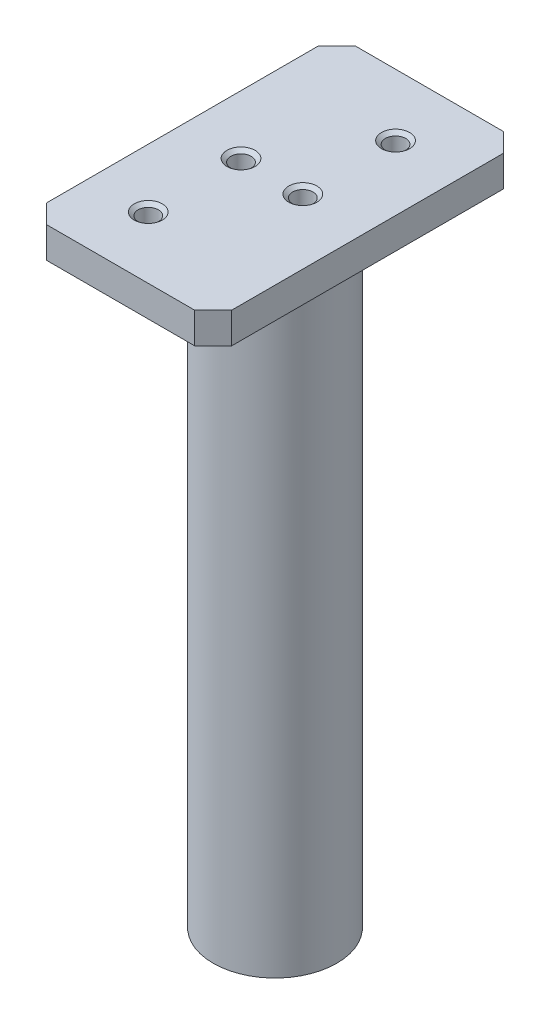
ISO-10303-21;
HEADER;
FILE_DESCRIPTION(('STEP AP214'),'2;1');
FILE_NAME('part.step','',(''),(''),'','','');
FILE_SCHEMA(('AUTOMOTIVE_DESIGN { 1 0 10303 214 1 1 1 1 }'));
ENDSEC;
DATA;
#1=APPLICATION_CONTEXT('core data for automotive mechanical design processes');
#2=APPLICATION_PROTOCOL_DEFINITION('international standard','automotive_design',2000,#1);
#3=PRODUCT_CONTEXT('',#1,'mechanical');
#4=PRODUCT('Part','Part','',(#3));
#5=PRODUCT_RELATED_PRODUCT_CATEGORY('part','',(#4));
#6=PRODUCT_DEFINITION_FORMATION('','',#4);
#7=PRODUCT_DEFINITION_CONTEXT('part definition',#1,'design');
#8=PRODUCT_DEFINITION('design','',#6,#7);
#9=PRODUCT_DEFINITION_SHAPE('','',#8);
#10=(LENGTH_UNIT() NAMED_UNIT(*) SI_UNIT(.MILLI.,.METRE.));
#11=(NAMED_UNIT(*) PLANE_ANGLE_UNIT() SI_UNIT($,.RADIAN.));
#12=(NAMED_UNIT(*) SI_UNIT($,.STERADIAN.) SOLID_ANGLE_UNIT());
#13=UNCERTAINTY_MEASURE_WITH_UNIT(LENGTH_MEASURE(1.E-05),#10,'distance_accuracy_value','');
#14=(GEOMETRIC_REPRESENTATION_CONTEXT(3) GLOBAL_UNCERTAINTY_ASSIGNED_CONTEXT((#13)) GLOBAL_UNIT_ASSIGNED_CONTEXT((#10,
#11,#12)) REPRESENTATION_CONTEXT('',''));
#15=CARTESIAN_POINT('',(0.,0.,0.));
#16=DIRECTION('',(0.,0.,1.));
#17=DIRECTION('',(1.,0.,0.));
#18=AXIS2_PLACEMENT_3D('',#15,#16,#17);
#19=CARTESIAN_POINT('',(15.,5.,-25.));
#20=DIRECTION('',(-1.,0.,0.));
#21=DIRECTION('',(0.,0.,1.));
#22=AXIS2_PLACEMENT_3D('',#19,#20,#21);
#23=PLANE('',#22);
#24=DIRECTION('',(0.,0.,-1.));
#25=VECTOR('',#24,1.);
#26=CARTESIAN_POINT('',(15.,0.,-25.));
#27=LINE('',#26,#25);
#28=CARTESIAN_POINT('',(15.,0.,22.));
#29=VERTEX_POINT('',#28);
#30=CARTESIAN_POINT('',(15.,0.,-22.));
#31=VERTEX_POINT('',#30);
#32=EDGE_CURVE('E197',#29,#31,#27,.T.);
#33=ORIENTED_EDGE('',*,*,#32,.T.);
#34=DIRECTION('',(0.,1.,0.));
#35=VECTOR('',#34,1.);
#36=CARTESIAN_POINT('',(15.,5.,-22.));
#37=LINE('',#36,#35);
#38=CARTESIAN_POINT('',(15.,5.,-22.));
#39=VERTEX_POINT('',#38);
#40=EDGE_CURVE('E11',#31,#39,#37,.T.);
#41=ORIENTED_EDGE('',*,*,#40,.T.);
#42=DIRECTION('',(0.,0.,-1.));
#43=VECTOR('',#42,1.);
#44=CARTESIAN_POINT('',(15.,5.,-25.));
#45=LINE('',#44,#43);
#46=CARTESIAN_POINT('',(15.,5.,22.));
#47=VERTEX_POINT('',#46);
#48=EDGE_CURVE('E146',#47,#39,#45,.T.);
#49=ORIENTED_EDGE('',*,*,#48,.F.);
#50=DIRECTION('',(0.,-1.,0.));
#51=VECTOR('',#50,1.);
#52=CARTESIAN_POINT('',(15.,5.,22.));
#53=LINE('',#52,#51);
#54=EDGE_CURVE('E59',#47,#29,#53,.T.);
#55=ORIENTED_EDGE('',*,*,#54,.T.);
#56=EDGE_LOOP('',(#33,#41,#49,#55));
#57=FACE_BOUND('',#56,.T.);
#58=ADVANCED_FACE('F49',(#57),#23,.F.);
#59=CARTESIAN_POINT('',(-15.,5.,-25.));
#60=DIRECTION('',(0.,0.,1.));
#61=DIRECTION('',(1.,0.,0.));
#62=AXIS2_PLACEMENT_3D('',#59,#60,#61);
#63=PLANE('',#62);
#64=DIRECTION('',(-1.,0.,0.));
#65=VECTOR('',#64,1.);
#66=CARTESIAN_POINT('',(-15.,0.,-25.));
#67=LINE('',#66,#65);
#68=CARTESIAN_POINT('',(12.,0.,-25.));
#69=VERTEX_POINT('',#68);
#70=CARTESIAN_POINT('',(-12.,0.,-25.));
#71=VERTEX_POINT('',#70);
#72=EDGE_CURVE('E153',#69,#71,#67,.T.);
#73=ORIENTED_EDGE('',*,*,#72,.T.);
#74=DIRECTION('',(0.,1.,0.));
#75=VECTOR('',#74,1.);
#76=CARTESIAN_POINT('',(-12.,5.,-25.));
#77=LINE('',#76,#75);
#78=CARTESIAN_POINT('',(-12.,5.,-25.));
#79=VERTEX_POINT('',#78);
#80=EDGE_CURVE('E66',#71,#79,#77,.T.);
#81=ORIENTED_EDGE('',*,*,#80,.T.);
#82=DIRECTION('',(-1.,0.,0.));
#83=VECTOR('',#82,1.);
#84=CARTESIAN_POINT('',(-15.,5.,-25.));
#85=LINE('',#84,#83);
#86=CARTESIAN_POINT('',(12.,5.,-25.));
#87=VERTEX_POINT('',#86);
#88=EDGE_CURVE('E151',#87,#79,#85,.T.);
#89=ORIENTED_EDGE('',*,*,#88,.F.);
#90=DIRECTION('',(0.,-1.,0.));
#91=VECTOR('',#90,1.);
#92=CARTESIAN_POINT('',(12.,5.,-25.));
#93=LINE('',#92,#91);
#94=EDGE_CURVE('E186',#87,#69,#93,.T.);
#95=ORIENTED_EDGE('',*,*,#94,.T.);
#96=EDGE_LOOP('',(#73,#81,#89,#95));
#97=FACE_BOUND('',#96,.T.);
#98=ADVANCED_FACE('F307',(#97),#63,.F.);
#99=CARTESIAN_POINT('',(-15.,5.,-25.));
#100=DIRECTION('',(1.,0.,0.));
#101=DIRECTION('',(0.,0.,-1.));
#102=AXIS2_PLACEMENT_3D('',#99,#100,#101);
#103=PLANE('',#102);
#104=DIRECTION('',(0.,0.,1.));
#105=VECTOR('',#104,1.);
#106=CARTESIAN_POINT('',(-15.,0.,-25.));
#107=LINE('',#106,#105);
#108=CARTESIAN_POINT('',(-15.,0.,-22.));
#109=VERTEX_POINT('',#108);
#110=CARTESIAN_POINT('',(-15.,0.,22.));
#111=VERTEX_POINT('',#110);
#112=EDGE_CURVE('E147',#109,#111,#107,.T.);
#113=ORIENTED_EDGE('',*,*,#112,.T.);
#114=DIRECTION('',(0.,1.,0.));
#115=VECTOR('',#114,1.);
#116=CARTESIAN_POINT('',(-15.,5.,22.));
#117=LINE('',#116,#115);
#118=CARTESIAN_POINT('',(-15.,5.,22.));
#119=VERTEX_POINT('',#118);
#120=EDGE_CURVE('E122',#111,#119,#117,.T.);
#121=ORIENTED_EDGE('',*,*,#120,.T.);
#122=DIRECTION('',(0.,0.,1.));
#123=VECTOR('',#122,1.);
#124=CARTESIAN_POINT('',(-15.,5.,-25.));
#125=LINE('',#124,#123);
#126=CARTESIAN_POINT('',(-15.,5.,-22.));
#127=VERTEX_POINT('',#126);
#128=EDGE_CURVE('E213',#127,#119,#125,.T.);
#129=ORIENTED_EDGE('',*,*,#128,.F.);
#130=DIRECTION('',(0.,-1.,0.));
#131=VECTOR('',#130,1.);
#132=CARTESIAN_POINT('',(-15.,5.,-22.));
#133=LINE('',#132,#131);
#134=EDGE_CURVE('E128',#127,#109,#133,.T.);
#135=ORIENTED_EDGE('',*,*,#134,.T.);
#136=EDGE_LOOP('',(#113,#121,#129,#135));
#137=FACE_BOUND('',#136,.T.);
#138=ADVANCED_FACE('F304',(#137),#103,.F.);
#139=CARTESIAN_POINT('',(-15.,5.,25.));
#140=DIRECTION('',(0.,0.,-1.));
#141=DIRECTION('',(-1.,0.,0.));
#142=AXIS2_PLACEMENT_3D('',#139,#140,#141);
#143=PLANE('',#142);
#144=DIRECTION('',(1.,0.,0.));
#145=VECTOR('',#144,1.);
#146=CARTESIAN_POINT('',(-15.,5.,25.));
#147=LINE('',#146,#145);
#148=CARTESIAN_POINT('',(-12.,5.,25.));
#149=VERTEX_POINT('',#148);
#150=CARTESIAN_POINT('',(12.,5.,25.));
#151=VERTEX_POINT('',#150);
#152=EDGE_CURVE('E138',#149,#151,#147,.T.);
#153=ORIENTED_EDGE('',*,*,#152,.F.);
#154=DIRECTION('',(0.,-1.,0.));
#155=VECTOR('',#154,1.);
#156=CARTESIAN_POINT('',(-12.,5.,25.));
#157=LINE('',#156,#155);
#158=CARTESIAN_POINT('',(-12.,0.,25.));
#159=VERTEX_POINT('',#158);
#160=EDGE_CURVE('E121',#149,#159,#157,.T.);
#161=ORIENTED_EDGE('',*,*,#160,.T.);
#162=DIRECTION('',(1.,0.,0.));
#163=VECTOR('',#162,1.);
#164=CARTESIAN_POINT('',(-15.,0.,25.));
#165=LINE('',#164,#163);
#166=CARTESIAN_POINT('',(12.,0.,25.));
#167=VERTEX_POINT('',#166);
#168=EDGE_CURVE('E135',#159,#167,#165,.T.);
#169=ORIENTED_EDGE('',*,*,#168,.T.);
#170=DIRECTION('',(0.,1.,0.));
#171=VECTOR('',#170,1.);
#172=CARTESIAN_POINT('',(12.,5.,25.));
#173=LINE('',#172,#171);
#174=EDGE_CURVE('E141',#167,#151,#173,.T.);
#175=ORIENTED_EDGE('',*,*,#174,.T.);
#176=EDGE_LOOP('',(#153,#161,#169,#175));
#177=FACE_BOUND('',#176,.T.);
#178=ADVANCED_FACE('F134',(#177),#143,.F.);
#179=CARTESIAN_POINT('',(0.,5.,0.));
#180=DIRECTION('',(0.,1.,0.));
#181=DIRECTION('',(0.,0.,1.));
#182=AXIS2_PLACEMENT_3D('',#179,#180,#181);
#183=PLANE('',#182);
#184=CARTESIAN_POINT('',(-5.49999999999999,5.,15.));
#185=DIRECTION('',(0.,1.,0.));
#186=DIRECTION('',(0.,0.,1.));
#187=AXIS2_PLACEMENT_3D('',#184,#185,#186);
#188=CIRCLE('',#187,2.275);
#189=CARTESIAN_POINT('',(-5.49999999999999,5.,17.275));
#190=VERTEX_POINT('',#189);
#191=EDGE_CURVE('E258',#190,#190,#188,.T.);
#192=ORIENTED_EDGE('',*,*,#191,.F.);
#193=EDGE_LOOP('',(#192));
#194=FACE_BOUND('',#193,.T.);
#195=CARTESIAN_POINT('',(-5.49999999999999,5.,0.));
#196=DIRECTION('',(0.,1.,0.));
#197=DIRECTION('',(0.,0.,1.));
#198=AXIS2_PLACEMENT_3D('',#195,#196,#197);
#199=CIRCLE('',#198,2.275);
#200=CARTESIAN_POINT('',(-5.49999999999999,5.,2.27500000000001));
#201=VERTEX_POINT('',#200);
#202=EDGE_CURVE('E246',#201,#201,#199,.T.);
#203=ORIENTED_EDGE('',*,*,#202,.F.);
#204=EDGE_LOOP('',(#203));
#205=FACE_BOUND('',#204,.T.);
#206=CARTESIAN_POINT('',(4.5,5.,0.));
#207=DIRECTION('',(0.,1.,0.));
#208=DIRECTION('',(0.,0.,1.));
#209=AXIS2_PLACEMENT_3D('',#206,#207,#208);
#210=CIRCLE('',#209,2.275);
#211=CARTESIAN_POINT('',(4.5,5.,2.275));
#212=VERTEX_POINT('',#211);
#213=EDGE_CURVE('E234',#212,#212,#210,.T.);
#214=ORIENTED_EDGE('',*,*,#213,.F.);
#215=EDGE_LOOP('',(#214));
#216=FACE_BOUND('',#215,.T.);
#217=CARTESIAN_POINT('',(4.5,5.,-15.));
#218=DIRECTION('',(0.,1.,0.));
#219=DIRECTION('',(0.,0.,1.));
#220=AXIS2_PLACEMENT_3D('',#217,#218,#219);
#221=CIRCLE('',#220,2.275);
#222=CARTESIAN_POINT('',(4.5,5.,-12.725));
#223=VERTEX_POINT('',#222);
#224=EDGE_CURVE('E222',#223,#223,#221,.T.);
#225=ORIENTED_EDGE('',*,*,#224,.F.);
#226=EDGE_LOOP('',(#225));
#227=FACE_BOUND('',#226,.T.);
#228=ORIENTED_EDGE('',*,*,#128,.T.);
#229=DIRECTION('',(-0.707106781186546,0.,-0.707106781186549));
#230=VECTOR('',#229,1.);
#231=CARTESIAN_POINT('',(-18.5,5.,18.4999999999999));
#232=LINE('',#231,#230);
#233=EDGE_CURVE('E183',#119,#149,#232,.F.);
#234=ORIENTED_EDGE('',*,*,#233,.T.);
#235=ORIENTED_EDGE('',*,*,#152,.T.);
#236=DIRECTION('',(-0.707106781186549,0.,0.707106781186546));
#237=VECTOR('',#236,1.);
#238=CARTESIAN_POINT('',(18.5,5.,18.5000000000001));
#239=LINE('',#238,#237);
#240=EDGE_CURVE('E175',#151,#47,#239,.F.);
#241=ORIENTED_EDGE('',*,*,#240,.T.);
#242=ORIENTED_EDGE('',*,*,#48,.T.);
#243=DIRECTION('',(0.707106781186546,0.,0.707106781186549));
#244=VECTOR('',#243,1.);
#245=CARTESIAN_POINT('',(18.5,5.,-18.4999999999999));
#246=LINE('',#245,#244);
#247=EDGE_CURVE('E73',#39,#87,#246,.F.);
#248=ORIENTED_EDGE('',*,*,#247,.T.);
#249=ORIENTED_EDGE('',*,*,#88,.T.);
#250=DIRECTION('',(0.707106781186549,0.,-0.707106781186546));
#251=VECTOR('',#250,1.);
#252=CARTESIAN_POINT('',(-18.5,5.,-18.5));
#253=LINE('',#252,#251);
#254=EDGE_CURVE('E180',#79,#127,#253,.F.);
#255=ORIENTED_EDGE('',*,*,#254,.T.);
#256=EDGE_LOOP('',(#228,#234,#235,#241,#242,#248,#249,#255));
#257=FACE_BOUND('',#256,.T.);
#258=ADVANCED_FACE('F279',(#194,#205,#216,#227,#257),#183,.T.);
#259=CARTESIAN_POINT('',(0.,0.,0.));
#260=DIRECTION('',(0.,1.,0.));
#261=DIRECTION('',(0.,0.,1.));
#262=AXIS2_PLACEMENT_3D('',#259,#260,#261);
#263=PLANE('',#262);
#264=CARTESIAN_POINT('',(0.,0.,0.));
#265=DIRECTION('',(0.,1.,0.));
#266=DIRECTION('',(0.,0.,1.));
#267=AXIS2_PLACEMENT_3D('',#264,#265,#266);
#268=CIRCLE('',#267,10.);
#269=CARTESIAN_POINT('',(0.,0.,10.));
#270=VERTEX_POINT('',#269);
#271=EDGE_CURVE('E157',#270,#270,#268,.F.);
#272=ORIENTED_EDGE('',*,*,#271,.F.);
#273=EDGE_LOOP('',(#272));
#274=FACE_BOUND('',#273,.T.);
#275=CARTESIAN_POINT('',(-5.49999999999999,0.,15.));
#276=DIRECTION('',(0.,1.,0.));
#277=DIRECTION('',(0.,0.,1.));
#278=AXIS2_PLACEMENT_3D('',#275,#276,#277);
#279=CIRCLE('',#278,1.64999999999995);
#280=CARTESIAN_POINT('',(-5.49999999999999,0.,16.65));
#281=VERTEX_POINT('',#280);
#282=EDGE_CURVE('E250',#281,#281,#279,.T.);
#283=ORIENTED_EDGE('',*,*,#282,.T.);
#284=EDGE_LOOP('',(#283));
#285=FACE_BOUND('',#284,.T.);
#286=CARTESIAN_POINT('',(4.5,0.,-15.));
#287=DIRECTION('',(0.,1.,0.));
#288=DIRECTION('',(0.,0.,1.));
#289=AXIS2_PLACEMENT_3D('',#286,#287,#288);
#290=CIRCLE('',#289,1.64999999999995);
#291=CARTESIAN_POINT('',(4.5,0.,-13.35));
#292=VERTEX_POINT('',#291);
#293=EDGE_CURVE('E203',#292,#292,#290,.T.);
#294=ORIENTED_EDGE('',*,*,#293,.T.);
#295=EDGE_LOOP('',(#294));
#296=FACE_BOUND('',#295,.T.);
#297=ORIENTED_EDGE('',*,*,#168,.F.);
#298=DIRECTION('',(0.707106781186546,0.,0.707106781186549));
#299=VECTOR('',#298,1.);
#300=CARTESIAN_POINT('',(-12.,0.,25.));
#301=LINE('',#300,#299);
#302=EDGE_CURVE('E117',#159,#111,#301,.F.);
#303=ORIENTED_EDGE('',*,*,#302,.T.);
#304=ORIENTED_EDGE('',*,*,#112,.F.);
#305=DIRECTION('',(-0.707106781186549,0.,0.707106781186546));
#306=VECTOR('',#305,1.);
#307=CARTESIAN_POINT('',(-15.,0.,-22.));
#308=LINE('',#307,#306);
#309=EDGE_CURVE('E129',#109,#71,#308,.F.);
#310=ORIENTED_EDGE('',*,*,#309,.T.);
#311=ORIENTED_EDGE('',*,*,#72,.F.);
#312=DIRECTION('',(-0.707106781186546,0.,-0.707106781186549));
#313=VECTOR('',#312,1.);
#314=CARTESIAN_POINT('',(12.,0.,-25.));
#315=LINE('',#314,#313);
#316=EDGE_CURVE('E165',#69,#31,#315,.F.);
#317=ORIENTED_EDGE('',*,*,#316,.T.);
#318=ORIENTED_EDGE('',*,*,#32,.F.);
#319=DIRECTION('',(0.707106781186549,0.,-0.707106781186546));
#320=VECTOR('',#319,1.);
#321=CARTESIAN_POINT('',(15.,0.,22.));
#322=LINE('',#321,#320);
#323=EDGE_CURVE('E140',#29,#167,#322,.F.);
#324=ORIENTED_EDGE('',*,*,#323,.T.);
#325=EDGE_LOOP('',(#297,#303,#304,#310,#311,#317,#318,#324));
#326=FACE_BOUND('',#325,.T.);
#327=ADVANCED_FACE('F143',(#274,#285,#296,#326),#263,.F.);
#328=CARTESIAN_POINT('',(4.5,5.,-15.));
#329=DIRECTION('',(0.,1.,0.));
#330=DIRECTION('',(0.,0.,1.));
#331=AXIS2_PLACEMENT_3D('',#328,#329,#330);
#332=CYLINDRICAL_SURFACE('',#331,1.64999999999995);
#333=ORIENTED_EDGE('',*,*,#293,.F.);
#334=EDGE_LOOP('',(#333));
#335=FACE_BOUND('',#334,.T.);
#336=CARTESIAN_POINT('',(4.5,4.47556273051408,-15.));
#337=DIRECTION('',(0.,1.,0.));
#338=DIRECTION('',(0.,0.,1.));
#339=AXIS2_PLACEMENT_3D('',#336,#337,#338);
#340=CIRCLE('',#339,1.6499999999999);
#341=CARTESIAN_POINT('',(4.5,4.47556273051408,-13.3500000000001));
#342=VERTEX_POINT('',#341);
#343=EDGE_CURVE('E208',#342,#342,#340,.T.);
#344=ORIENTED_EDGE('',*,*,#343,.T.);
#345=EDGE_LOOP('',(#344));
#346=FACE_BOUND('',#345,.T.);
#347=ADVANCED_FACE('F278',(#335,#346),#332,.F.);
#348=CARTESIAN_POINT('',(4.5,5.,-15.));
#349=DIRECTION('',(0.,1.,0.));
#350=DIRECTION('',(0.,0.,1.));
#351=AXIS2_PLACEMENT_3D('',#348,#349,#350);
#352=CONICAL_SURFACE('',#351,2.275,0.872664625997128);
#353=ORIENTED_EDGE('',*,*,#343,.F.);
#354=EDGE_LOOP('',(#353));
#355=FACE_BOUND('',#354,.T.);
#356=ORIENTED_EDGE('',*,*,#224,.T.);
#357=EDGE_LOOP('',(#356));
#358=FACE_BOUND('',#357,.T.);
#359=ADVANCED_FACE('F287',(#355,#358),#352,.F.);
#360=CARTESIAN_POINT('',(4.5,5.,0.));
#361=DIRECTION('',(0.,1.,0.));
#362=DIRECTION('',(0.,0.,1.));
#363=AXIS2_PLACEMENT_3D('',#360,#361,#362);
#364=CYLINDRICAL_SURFACE('',#363,1.64999999999995);
#365=CARTESIAN_POINT('',(4.5,0.,0.));
#366=DIRECTION('',(0.,1.,0.));
#367=DIRECTION('',(0.,0.,1.));
#368=AXIS2_PLACEMENT_3D('',#365,#366,#367);
#369=CIRCLE('',#368,1.64999999999995);
#370=CARTESIAN_POINT('',(4.5,0.,1.64999999999995));
#371=VERTEX_POINT('',#370);
#372=EDGE_CURVE('E226',#371,#371,#369,.T.);
#373=ORIENTED_EDGE('',*,*,#372,.F.);
#374=EDGE_LOOP('',(#373));
#375=FACE_BOUND('',#374,.T.);
#376=CARTESIAN_POINT('',(4.5,4.47556273051408,0.));
#377=DIRECTION('',(0.,1.,0.));
#378=DIRECTION('',(0.,0.,1.));
#379=AXIS2_PLACEMENT_3D('',#376,#377,#378);
#380=CIRCLE('',#379,1.6499999999999);
#381=CARTESIAN_POINT('',(4.5,4.47556273051408,1.6499999999999));
#382=VERTEX_POINT('',#381);
#383=EDGE_CURVE('E230',#382,#382,#380,.T.);
#384=ORIENTED_EDGE('',*,*,#383,.T.);
#385=EDGE_LOOP('',(#384));
#386=FACE_BOUND('',#385,.T.);
#387=ADVANCED_FACE('F293',(#375,#386),#364,.F.);
#388=CARTESIAN_POINT('',(4.5,5.,0.));
#389=DIRECTION('',(0.,1.,0.));
#390=DIRECTION('',(0.,0.,1.));
#391=AXIS2_PLACEMENT_3D('',#388,#389,#390);
#392=CONICAL_SURFACE('',#391,2.275,0.872664625997128);
#393=ORIENTED_EDGE('',*,*,#383,.F.);
#394=EDGE_LOOP('',(#393));
#395=FACE_BOUND('',#394,.T.);
#396=ORIENTED_EDGE('',*,*,#213,.T.);
#397=EDGE_LOOP('',(#396));
#398=FACE_BOUND('',#397,.T.);
#399=ADVANCED_FACE('F434',(#395,#398),#392,.F.);
#400=CARTESIAN_POINT('',(-5.49999999999999,5.,0.));
#401=DIRECTION('',(0.,1.,0.));
#402=DIRECTION('',(0.,0.,1.));
#403=AXIS2_PLACEMENT_3D('',#400,#401,#402);
#404=CYLINDRICAL_SURFACE('',#403,1.64999999999995);
#405=CARTESIAN_POINT('',(-5.49999999999999,0.,0.));
#406=DIRECTION('',(0.,1.,0.));
#407=DIRECTION('',(0.,0.,1.));
#408=AXIS2_PLACEMENT_3D('',#405,#406,#407);
#409=CIRCLE('',#408,1.64999999999995);
#410=CARTESIAN_POINT('',(-5.49999999999999,0.,1.64999999999996));
#411=VERTEX_POINT('',#410);
#412=EDGE_CURVE('E238',#411,#411,#409,.T.);
#413=ORIENTED_EDGE('',*,*,#412,.F.);
#414=EDGE_LOOP('',(#413));
#415=FACE_BOUND('',#414,.T.);
#416=CARTESIAN_POINT('',(-5.49999999999999,4.47556273051408,0.));
#417=DIRECTION('',(0.,1.,0.));
#418=DIRECTION('',(0.,0.,1.));
#419=AXIS2_PLACEMENT_3D('',#416,#417,#418);
#420=CIRCLE('',#419,1.6499999999999);
#421=CARTESIAN_POINT('',(-5.49999999999999,4.47556273051408,1.64999999999991));
#422=VERTEX_POINT('',#421);
#423=EDGE_CURVE('E242',#422,#422,#420,.T.);
#424=ORIENTED_EDGE('',*,*,#423,.T.);
#425=EDGE_LOOP('',(#424));
#426=FACE_BOUND('',#425,.T.);
#427=ADVANCED_FACE('F424',(#415,#426),#404,.F.);
#428=CARTESIAN_POINT('',(-5.49999999999999,5.,0.));
#429=DIRECTION('',(0.,1.,0.));
#430=DIRECTION('',(0.,0.,1.));
#431=AXIS2_PLACEMENT_3D('',#428,#429,#430);
#432=CONICAL_SURFACE('',#431,2.275,0.872664625997127);
#433=ORIENTED_EDGE('',*,*,#423,.F.);
#434=EDGE_LOOP('',(#433));
#435=FACE_BOUND('',#434,.T.);
#436=ORIENTED_EDGE('',*,*,#202,.T.);
#437=EDGE_LOOP('',(#436));
#438=FACE_BOUND('',#437,.T.);
#439=ADVANCED_FACE('F414',(#435,#438),#432,.F.);
#440=CARTESIAN_POINT('',(-5.49999999999999,5.,15.));
#441=DIRECTION('',(0.,1.,0.));
#442=DIRECTION('',(0.,0.,1.));
#443=AXIS2_PLACEMENT_3D('',#440,#441,#442);
#444=CYLINDRICAL_SURFACE('',#443,1.64999999999995);
#445=ORIENTED_EDGE('',*,*,#282,.F.);
#446=EDGE_LOOP('',(#445));
#447=FACE_BOUND('',#446,.T.);
#448=CARTESIAN_POINT('',(-5.49999999999999,4.47556273051408,15.));
#449=DIRECTION('',(0.,1.,0.));
#450=DIRECTION('',(0.,0.,1.));
#451=AXIS2_PLACEMENT_3D('',#448,#449,#450);
#452=CIRCLE('',#451,1.6499999999999);
#453=CARTESIAN_POINT('',(-5.49999999999999,4.47556273051408,16.6499999999999));
#454=VERTEX_POINT('',#453);
#455=EDGE_CURVE('E254',#454,#454,#452,.T.);
#456=ORIENTED_EDGE('',*,*,#455,.T.);
#457=EDGE_LOOP('',(#456));
#458=FACE_BOUND('',#457,.T.);
#459=ADVANCED_FACE('F404',(#447,#458),#444,.F.);
#460=CARTESIAN_POINT('',(-5.49999999999999,5.,15.));
#461=DIRECTION('',(0.,1.,0.));
#462=DIRECTION('',(0.,0.,1.));
#463=AXIS2_PLACEMENT_3D('',#460,#461,#462);
#464=CONICAL_SURFACE('',#463,2.275,0.872664625997127);
#465=ORIENTED_EDGE('',*,*,#455,.F.);
#466=EDGE_LOOP('',(#465));
#467=FACE_BOUND('',#466,.T.);
#468=ORIENTED_EDGE('',*,*,#191,.T.);
#469=EDGE_LOOP('',(#468));
#470=FACE_BOUND('',#469,.T.);
#471=ADVANCED_FACE('F395',(#467,#470),#464,.F.);
#472=CARTESIAN_POINT('',(0.,0.,0.));
#473=DIRECTION('',(0.,-1.,0.));
#474=DIRECTION('',(0.,0.,-1.));
#475=AXIS2_PLACEMENT_3D('',#472,#473,#474);
#476=PLANE('',#475);
#477=ORIENTED_EDGE('',*,*,#412,.T.);
#478=EDGE_LOOP('',(#477));
#479=FACE_BOUND('',#478,.T.);
#480=ADVANCED_FACE('F385',(#479),#476,.F.);
#481=ORIENTED_EDGE('',*,*,#372,.T.);
#482=EDGE_LOOP('',(#481));
#483=FACE_BOUND('',#482,.T.);
#484=ADVANCED_FACE('F272',(#483),#476,.F.);
#485=CARTESIAN_POINT('',(0.,-100.,0.));
#486=DIRECTION('',(0.,1.,0.));
#487=DIRECTION('',(0.,0.,1.));
#488=AXIS2_PLACEMENT_3D('',#485,#486,#487);
#489=CYLINDRICAL_SURFACE('',#488,10.);
#490=CARTESIAN_POINT('',(0.,-100.,0.));
#491=DIRECTION('',(0.,-1.,0.));
#492=DIRECTION('',(0.,0.,-1.));
#493=AXIS2_PLACEMENT_3D('',#490,#491,#492);
#494=CIRCLE('',#493,10.);
#495=CARTESIAN_POINT('',(0.,-100.,-10.));
#496=VERTEX_POINT('',#495);
#497=EDGE_CURVE('E262',#496,#496,#494,.T.);
#498=ORIENTED_EDGE('',*,*,#497,.F.);
#499=EDGE_LOOP('',(#498));
#500=FACE_BOUND('',#499,.T.);
#501=ORIENTED_EDGE('',*,*,#271,.T.);
#502=EDGE_LOOP('',(#501));
#503=FACE_BOUND('',#502,.T.);
#504=ADVANCED_FACE('F269',(#500,#503),#489,.T.);
#505=CARTESIAN_POINT('',(0.,-100.,0.));
#506=DIRECTION('',(0.,-1.,0.));
#507=DIRECTION('',(0.,0.,-1.));
#508=AXIS2_PLACEMENT_3D('',#505,#506,#507);
#509=PLANE('',#508);
#510=ORIENTED_EDGE('',*,*,#497,.T.);
#511=EDGE_LOOP('',(#510));
#512=FACE_BOUND('',#511,.T.);
#513=ADVANCED_FACE('F267',(#512),#509,.T.);
#514=CARTESIAN_POINT('',(-12.,5.,25.));
#515=DIRECTION('',(0.707106781186549,0.,-0.707106781186546));
#516=DIRECTION('',(0.,-1.,0.));
#517=AXIS2_PLACEMENT_3D('',#514,#515,#516);
#518=PLANE('',#517);
#519=ORIENTED_EDGE('',*,*,#233,.F.);
#520=ORIENTED_EDGE('',*,*,#120,.F.);
#521=ORIENTED_EDGE('',*,*,#302,.F.);
#522=ORIENTED_EDGE('',*,*,#160,.F.);
#523=EDGE_LOOP('',(#519,#520,#521,#522));
#524=FACE_BOUND('',#523,.T.);
#525=ADVANCED_FACE('F120',(#524),#518,.F.);
#526=CARTESIAN_POINT('',(-15.,5.,-22.));
#527=DIRECTION('',(0.707106781186546,0.,0.707106781186549));
#528=DIRECTION('',(0.,-1.,0.));
#529=AXIS2_PLACEMENT_3D('',#526,#527,#528);
#530=PLANE('',#529);
#531=ORIENTED_EDGE('',*,*,#254,.F.);
#532=ORIENTED_EDGE('',*,*,#80,.F.);
#533=ORIENTED_EDGE('',*,*,#309,.F.);
#534=ORIENTED_EDGE('',*,*,#134,.F.);
#535=EDGE_LOOP('',(#531,#532,#533,#534));
#536=FACE_BOUND('',#535,.T.);
#537=ADVANCED_FACE('F306',(#536),#530,.F.);
#538=CARTESIAN_POINT('',(12.,5.,-25.));
#539=DIRECTION('',(-0.707106781186549,0.,0.707106781186546));
#540=DIRECTION('',(0.,-1.,0.));
#541=AXIS2_PLACEMENT_3D('',#538,#539,#540);
#542=PLANE('',#541);
#543=ORIENTED_EDGE('',*,*,#247,.F.);
#544=ORIENTED_EDGE('',*,*,#40,.F.);
#545=ORIENTED_EDGE('',*,*,#316,.F.);
#546=ORIENTED_EDGE('',*,*,#94,.F.);
#547=EDGE_LOOP('',(#543,#544,#545,#546));
#548=FACE_BOUND('',#547,.T.);
#549=ADVANCED_FACE('F310',(#548),#542,.F.);
#550=CARTESIAN_POINT('',(15.,5.,22.));
#551=DIRECTION('',(-0.707106781186546,0.,-0.707106781186549));
#552=DIRECTION('',(0.,-1.,0.));
#553=AXIS2_PLACEMENT_3D('',#550,#551,#552);
#554=PLANE('',#553);
#555=ORIENTED_EDGE('',*,*,#240,.F.);
#556=ORIENTED_EDGE('',*,*,#174,.F.);
#557=ORIENTED_EDGE('',*,*,#323,.F.);
#558=ORIENTED_EDGE('',*,*,#54,.F.);
#559=EDGE_LOOP('',(#555,#556,#557,#558));
#560=FACE_BOUND('',#559,.T.);
#561=ADVANCED_FACE('F52',(#560),#554,.F.);
#562=CLOSED_SHELL('',(#58,#98,#138,#178,#258,#327,#347,#359,#387,#399,#427,#439,#459,#471,#480,
#484,#504,#513,#525,#537,#549,#561));
#563=MANIFOLD_SOLID_BREP('B2',#562);
#564=ADVANCED_BREP_SHAPE_REPRESENTATION('',(#18,#563),#14);
#565=SHAPE_DEFINITION_REPRESENTATION(#9,#564);
ENDSEC;
END-ISO-10303-21;
